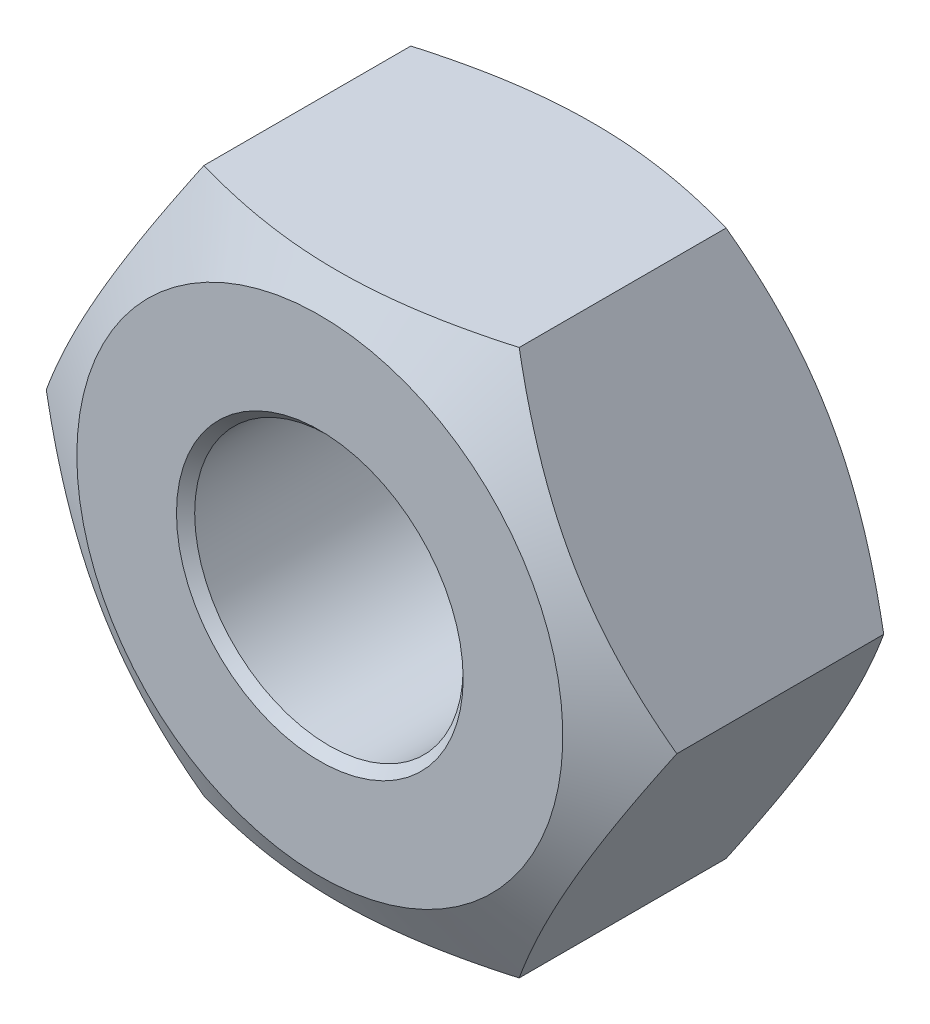
ISO-10303-21;
HEADER;
FILE_DESCRIPTION(('STEP AP214'),'2;1');
FILE_NAME('part.step','',(''),(''),'','','');
FILE_SCHEMA(('AUTOMOTIVE_DESIGN { 1 0 10303 214 1 1 1 1 }'));
ENDSEC;
DATA;
#1=APPLICATION_CONTEXT('core data for automotive mechanical design processes');
#2=APPLICATION_PROTOCOL_DEFINITION('international standard','automotive_design',2000,#1);
#3=PRODUCT_CONTEXT('',#1,'mechanical');
#4=PRODUCT('Part','Part','',(#3));
#5=PRODUCT_RELATED_PRODUCT_CATEGORY('part','',(#4));
#6=PRODUCT_DEFINITION_FORMATION('','',#4);
#7=PRODUCT_DEFINITION_CONTEXT('part definition',#1,'design');
#8=PRODUCT_DEFINITION('design','',#6,#7);
#9=PRODUCT_DEFINITION_SHAPE('','',#8);
#10=(LENGTH_UNIT() NAMED_UNIT(*) SI_UNIT(.MILLI.,.METRE.));
#11=(NAMED_UNIT(*) PLANE_ANGLE_UNIT() SI_UNIT($,.RADIAN.));
#12=(NAMED_UNIT(*) SI_UNIT($,.STERADIAN.) SOLID_ANGLE_UNIT());
#13=UNCERTAINTY_MEASURE_WITH_UNIT(LENGTH_MEASURE(1.E-05),#10,'distance_accuracy_value','');
#14=(GEOMETRIC_REPRESENTATION_CONTEXT(3) GLOBAL_UNCERTAINTY_ASSIGNED_CONTEXT((#13)) GLOBAL_UNIT_ASSIGNED_CONTEXT((#10,
#11,#12)) REPRESENTATION_CONTEXT('',''));
#15=CARTESIAN_POINT('',(0.,0.,0.));
#16=DIRECTION('',(0.,0.,1.));
#17=DIRECTION('',(1.,0.,0.));
#18=AXIS2_PLACEMENT_3D('',#15,#16,#17);
#19=CARTESIAN_POINT('',(-2.88675134594813,-5.,-5.));
#20=DIRECTION('',(0.,-1.,0.));
#21=DIRECTION('',(1.,0.,0.));
#22=AXIS2_PLACEMENT_3D('',#19,#20,#21);
#23=PLANE('',#22);
#24=DIRECTION('',(0.,0.,1.));
#25=VECTOR('',#24,1.);
#26=CARTESIAN_POINT('',(2.88675134594813,-5.,-5.));
#27=LINE('',#26,#25);
#28=CARTESIAN_POINT('',(2.88675134594813,-5.,-4.5534180126148));
#29=VERTEX_POINT('',#28);
#30=CARTESIAN_POINT('',(2.88675134594813,-5.,-0.764124635439491));
#31=VERTEX_POINT('',#30);
#32=EDGE_CURVE('E156',#29,#31,#27,.T.);
#33=ORIENTED_EDGE('',*,*,#32,.T.);
#34=CARTESIAN_POINT('',(-7.61213425479239,-5.,-2.68894648914603));
#35=CARTESIAN_POINT('',(-7.3948889565014,-5.,-2.58414239199444));
#36=CARTESIAN_POINT('',(-7.17712937426538,-5.,-2.48038525661442));
#37=CARTESIAN_POINT('',(-6.74030754384856,-5.,-2.27555685645105));
#38=CARTESIAN_POINT('',(-6.52124508308995,-5.,-2.17448604554796));
#39=CARTESIAN_POINT('',(-6.08034501249064,-5.,-1.97508293678218));
#40=CARTESIAN_POINT('',(-5.85849868010001,-5.,-1.87676985566878));
#41=CARTESIAN_POINT('',(-5.41299082933384,-5.,-1.68436208094923));
#42=CARTESIAN_POINT('',(-5.1893294018471,-5.,-1.59026717764324));
#43=CARTESIAN_POINT('',(-4.73321305137921,-5.,-1.40472032728572));
#44=CARTESIAN_POINT('',(-4.50069300295434,-5.,-1.31342756374782));
#45=CARTESIAN_POINT('',(-4.0328806521826,-5.,-1.13810188533926));
#46=CARTESIAN_POINT('',(-3.79758803488674,-5.,-1.05406980445603));
#47=CARTESIAN_POINT('',(-3.32434461286665,-5.,-0.895576109525233));
#48=CARTESIAN_POINT('',(-3.08640080404566,-5.,-0.82109382456439));
#49=CARTESIAN_POINT('',(-2.60710461151499,-5.,-0.684182629015213));
#50=CARTESIAN_POINT('',(-2.36575337281578,-5.,-0.621749768222116));
#51=CARTESIAN_POINT('',(-1.880803054091,-5.,-0.512345343727814));
#52=CARTESIAN_POINT('',(-1.63722177795954,-5.,-0.465296355150959));
#53=CARTESIAN_POINT('',(-1.1471854987077,-5.,-0.389419092612148));
#54=CARTESIAN_POINT('',(-0.90073072474934,-5.,-0.360589375646157));
#55=CARTESIAN_POINT('',(-0.409334848770287,-5.,-0.323829331526711));
#56=CARTESIAN_POINT('',(-0.164413482834264,-5.,-0.315641623350303));
#57=CARTESIAN_POINT('',(0.325250484148297,-5.,-0.320190384970031));
#58=CARTESIAN_POINT('',(0.569993078418964,-5.,-0.332927610488442));
#59=CARTESIAN_POINT('',(0.989828358735596,-5.,-0.371847045048092));
#60=CARTESIAN_POINT('',(1.16538182546897,-5.,-0.393311120443773));
#61=CARTESIAN_POINT('',(1.51510090460426,-5.,-0.44558937927738));
#62=CARTESIAN_POINT('',(1.6892663058974,-5.,-0.476404958136303));
#63=CARTESIAN_POINT('',(2.20950567321371,-5.,-0.581248029050565));
#64=CARTESIAN_POINT('',(2.5531082161631,-5.,-0.667649433040249));
#65=CARTESIAN_POINT('',(3.06674374801753,-5.,-0.816168336586558));
#66=CARTESIAN_POINT('',(3.23946944011554,-5.,-0.869492780027783));
#67=CARTESIAN_POINT('',(3.58324138994349,-5.,-0.981352614834414));
#68=CARTESIAN_POINT('',(3.75428763687561,-5.,-1.03988803967898));
#69=CARTESIAN_POINT('',(4.09476163313024,-5.,-1.16125800362621));
#70=CARTESIAN_POINT('',(4.26418996591549,-5.,-1.2240909206405));
#71=CARTESIAN_POINT('',(4.60166504972674,-5.,-1.35334949195901));
#72=CARTESIAN_POINT('',(4.76971181361607,-5.,-1.41977511276898));
#73=CARTESIAN_POINT('',(5.15162364790194,-5.,-1.57469885567006));
#74=CARTESIAN_POINT('',(5.3650989772056,-5.,-1.66415571518046));
#75=CARTESIAN_POINT('',(5.79037105085927,-5.,-1.84698394027787));
#76=CARTESIAN_POINT('',(6.00216771571146,-5.,-1.94035548995433));
#77=CARTESIAN_POINT('',(6.4243757668238,-5.,-2.13026222167517));
#78=CARTESIAN_POINT('',(6.63478692347228,-5.,-2.22679791299771));
#79=CARTESIAN_POINT('',(7.05441507049925,-5.,-2.42243424278575));
#80=CARTESIAN_POINT('',(7.26363203938376,-5.,-2.52153492724155));
#81=CARTESIAN_POINT('',(7.89012961940281,-5.,-2.82213872733976));
#82=CARTESIAN_POINT('',(8.30590267455421,-5.,-3.02678226907475));
#83=CARTESIAN_POINT('',(9.13456044626856,-5.,-3.44183489575062));
#84=CARTESIAN_POINT('',(9.54744506984694,-5.,-3.6522441652398));
#85=CARTESIAN_POINT('',(10.1491483676931,-5.,-3.96271346750927));
#86=CARTESIAN_POINT('',(10.3388136141893,-5.,-4.0611374866698));
#87=CARTESIAN_POINT('',(10.717738444617,-5.,-4.2587558659921));
#88=CARTESIAN_POINT('',(10.9069980351519,-5.,-4.3579502134908));
#89=CARTESIAN_POINT('',(11.4742616168287,-5.,-4.656543844784));
#90=CARTESIAN_POINT('',(11.8517372900347,-5.,-4.85694692533336));
#91=CARTESIAN_POINT('',(12.6047822268112,-5.,-5.25937643858843));
#92=CARTESIAN_POINT('',(12.9803538413534,-5.,-5.46139848004441));
#93=CARTESIAN_POINT('',(13.7305954352244,-5.,-5.86706817687967));
#94=CARTESIAN_POINT('',(14.1052654565119,-5.,-6.07071575462754));
#95=CARTESIAN_POINT('',(14.4795992593037,-5.,-6.2749757323787));
#96=B_SPLINE_CURVE_WITH_KNOTS('',3,(#34,#35,#36,#37,#38,#39,#40,#41,#42,#43,#44,#45,#46,#47,#48,
#49,#50,#51,#52,#53,#54,#55,#56,#57,#58,#59,#60,#61,#62,#63,#64,#65,#66,#67,#68,#69,#70,#71,#72,
#73,#74,#75,#76,#77,#78,#79,#80,#81,#82,#83,#84,#85,#86,#87,#88,#89,#90,#91,#92,#93,#94,#95),
.UNSPECIFIED.,.F.,.F.,(4,2,2,2,2,2,2,2,2,2,2,2,2,2,2,2,2,2,2,2,2,2,2,2,2,2,2,2,2,2,4),(0.,
0.723621873606645,1.44736524269466,2.17529398417115,2.90318649763325,3.65249228969477,
4.40188403554204,5.14962527863226,5.8971209691492,6.6407945411558,7.38440920529141,
8.11870497867228,8.85302727236996,9.38334948856281,9.91375087779369,10.9751980231144,
11.5174654180309,12.0597362971217,12.601803613746,13.1438658776264,13.8381979540105,
14.5325627182662,15.2270397967974,15.921529335934,17.3116758698269,18.7018669513559,
19.3429128846726,19.9839483023529,21.2660634794198,22.5454351831284,23.8247461486113),.UNSPECIFIED.);
#97=CARTESIAN_POINT('',(-2.88675134594812,-5.,-0.764124635439491));
#98=VERTEX_POINT('',#97);
#99=EDGE_CURVE('E57',#31,#98,#96,.F.);
#100=ORIENTED_EDGE('',*,*,#99,.T.);
#101=DIRECTION('',(0.,0.,1.));
#102=VECTOR('',#101,1.);
#103=CARTESIAN_POINT('',(-2.88675134594813,-5.,-5.));
#104=LINE('',#103,#102);
#105=CARTESIAN_POINT('',(-2.88675134594813,-5.,-4.5534180126148));
#106=VERTEX_POINT('',#105);
#107=EDGE_CURVE('E131',#106,#98,#104,.T.);
#108=ORIENTED_EDGE('',*,*,#107,.F.);
#109=CARTESIAN_POINT('',(-7.65609177212317,-5.,-2.60736561074588));
#110=CARTESIAN_POINT('',(-7.43656343758357,-5.,-2.71345383603735));
#111=CARTESIAN_POINT('',(-7.21651606414283,-5.,-2.81848745648449));
#112=CARTESIAN_POINT('',(-6.77510259917478,-5.,-3.02584285104626));
#113=CARTESIAN_POINT('',(-6.55373628734637,-5.,-3.12816415563486));
#114=CARTESIAN_POINT('',(-6.10820850200618,-5.,-3.33003131625318));
#115=CARTESIAN_POINT('',(-5.88403828224006,-5.,-3.42955793867599));
#116=CARTESIAN_POINT('',(-5.43385534806404,-5.,-3.62433627144146));
#117=CARTESIAN_POINT('',(-5.20784273042233,-5.,-3.7195882046157));
#118=CARTESIAN_POINT('',(-4.7508098249394,-5.,-3.90581130250879));
#119=CARTESIAN_POINT('',(-4.5197621235661,-5.,-3.99671555609044));
#120=CARTESIAN_POINT('',(-4.05494131662996,-5.,-4.17140441293615));
#121=CARTESIAN_POINT('',(-3.82116791112761,-5.,-4.25518822408778));
#122=CARTESIAN_POINT('',(-3.35100475142416,-5.,-4.4133851804978));
#123=CARTESIAN_POINT('',(-3.11462176833116,-5.,-4.48781824774764));
#124=CARTESIAN_POINT('',(-2.63849286059446,-5.,-4.62489550422514));
#125=CARTESIAN_POINT('',(-2.39874802529956,-5.,-4.68754342151799));
#126=CARTESIAN_POINT('',(-1.91574317494575,-5.,-4.79801221973906));
#127=CARTESIAN_POINT('',(-1.67248224143162,-5.,-4.84582915057248));
#128=CARTESIAN_POINT('',(-1.18299341060266,-5.,-4.92340447175774));
#129=CARTESIAN_POINT('',(-0.936765510666784,-5.,-4.95316284615529));
#130=CARTESIAN_POINT('',(-0.567031819079376,-5.,-4.98234882914511));
#131=CARTESIAN_POINT('',(-0.444104782955955,-5.,-4.98950370802072));
#132=CARTESIAN_POINT('',(-0.198052381774448,-5.,-4.99860456276109));
#133=CARTESIAN_POINT('',(-0.074927019312685,-5.,-5.0005506062699));
#134=CARTESIAN_POINT('',(0.171258785818514,-5.,-4.99918151488384));
#135=CARTESIAN_POINT('',(0.294319237008563,-5.,-4.99586785791504));
#136=CARTESIAN_POINT('',(0.540193677552173,-5.,-4.98406334471061));
#137=CARTESIAN_POINT('',(0.663007654153308,-5.,-4.97557222718951));
#138=CARTESIAN_POINT('',(0.960682957245838,-5.,-4.94889350203738));
#139=CARTESIAN_POINT('',(1.13531547825311,-5.,-4.92811089000247));
#140=CARTESIAN_POINT('',(1.48321793429819,-5.,-4.87723415140654));
#141=CARTESIAN_POINT('',(1.65648768447755,-5.,-4.84713878317962));
#142=CARTESIAN_POINT('',(2.00155552519326,-5.,-4.77870093677783));
#143=CARTESIAN_POINT('',(2.17335196708859,-5.,-4.74035022487923));
#144=CARTESIAN_POINT('',(2.51518303239447,-5.,-4.65657134433363));
#145=CARTESIAN_POINT('',(2.68521776239755,-5.,-4.61114360658132));
#146=CARTESIAN_POINT('',(3.02770462413248,-5.,-4.51311178880933));
#147=CARTESIAN_POINT('',(3.20011394779935,-5.,-4.46035918063097));
#148=CARTESIAN_POINT('',(3.54311022463379,-5.,-4.349641705112));
#149=CARTESIAN_POINT('',(3.71369834521277,-5.,-4.29168043287631));
#150=CARTESIAN_POINT('',(4.05236770745106,-5.,-4.17174287579222));
#151=CARTESIAN_POINT('',(4.22045765494591,-5.,-4.10979102646219));
#152=CARTESIAN_POINT('',(4.55533340532884,-5.,-3.98225110922803));
#153=CARTESIAN_POINT('',(4.72211864960305,-5.,-3.91666157168731));
#154=CARTESIAN_POINT('',(4.88829798170486,-5.,-3.84961303777573));
#155=B_SPLINE_CURVE_WITH_KNOTS('',3,(#109,#110,#111,#112,#113,#114,#115,#116,#117,#118,#119,
#120,#121,#122,#123,#124,#125,#126,#127,#128,#129,#130,#131,#132,#133,#134,#135,#136,#137,#138,
#139,#140,#141,#142,#143,#144,#145,#146,#147,#148,#149,#150,#151,#152,#153,#154),.UNSPECIFIED.,
.F.,.F.,(4,2,2,2,2,2,2,2,2,2,2,2,2,2,2,2,2,2,2,2,2,2,4),(0.,0.731464953869324,1.4630557146924,
2.19883307522443,2.93457203639889,3.67934358933834,4.42419788610861,5.16743732301151,
5.91044124982453,6.6536428992009,7.39684520517621,7.76615669447498,8.13546338772164,
8.50466632765175,8.87388790130249,9.40118856909615,9.92855957198324,10.4564590222235,
10.9843263431151,11.5251238300906,12.0655508754377,12.6029360338292,13.1405399016667),.UNSPECIFIED.);
#156=CARTESIAN_POINT('',(0.,-5.,-5.));
#157=VERTEX_POINT('',#156);
#158=EDGE_CURVE('E258',#106,#157,#155,.T.);
#159=ORIENTED_EDGE('',*,*,#158,.T.);
#160=EDGE_CURVE('E251',#157,#29,#155,.T.);
#161=ORIENTED_EDGE('',*,*,#160,.T.);
#162=EDGE_LOOP('',(#33,#100,#108,#159,#161));
#163=FACE_BOUND('',#162,.T.);
#164=ADVANCED_FACE('F41',(#163),#23,.T.);
#165=CARTESIAN_POINT('',(-5.77350269189626,0.,-5.));
#166=DIRECTION('',(-0.866025403784439,-0.5,0.));
#167=DIRECTION('',(0.5,-0.866025403784439,0.));
#168=AXIS2_PLACEMENT_3D('',#165,#166,#167);
#169=PLANE('',#168);
#170=ORIENTED_EDGE('',*,*,#107,.T.);
#171=CARTESIAN_POINT('',(-2.88663587589429,-5.0002,-0.764191304106116));
#172=CARTESIAN_POINT('',(-3.01349970319368,-4.78046540547481,-0.690929215691922));
#173=CARTESIAN_POINT('',(-3.14144859993849,-4.55885141554042,-0.62429396997238));
#174=CARTESIAN_POINT('',(-3.39956193532121,-4.11178600454649,-0.5079816390651));
#175=CARTESIAN_POINT('',(-3.52973095989718,-3.88632664040923,-0.458345697970078));
#176=CARTESIAN_POINT('',(-3.78847564779797,-3.43816769477649,-0.381093673472988));
#177=CARTESIAN_POINT('',(-3.91701101576052,-3.21553790689581,-0.352963026337779));
#178=CARTESIAN_POINT('',(-4.11026620624322,-2.88081009815336,-0.327737570007975));
#179=CARTESIAN_POINT('',(-4.17472868879311,-2.76915780319494,-0.322156107823774));
#180=CARTESIAN_POINT('',(-4.30371322717528,-2.5457500293262,-0.316744864805761));
#181=CARTESIAN_POINT('',(-4.36823528110588,-2.43399455370969,-0.316914906312494));
#182=CARTESIAN_POINT('',(-4.54500768479194,-2.12781576914936,-0.325296279846327));
#183=CARTESIAN_POINT('',(-4.65719946015292,-1.93349391403279,-0.339372419951542));
#184=CARTESIAN_POINT('',(-4.88083840557981,-1.54613989800229,-0.384007905163721));
#185=CARTESIAN_POINT('',(-4.9922847895602,-1.35310909862843,-0.414582508201798));
#186=CARTESIAN_POINT('',(-5.21637431361295,-0.964974657525145,-0.491011141675453));
#187=CARTESIAN_POINT('',(-5.32898917185759,-0.769920001358263,-0.537189026932969));
#188=CARTESIAN_POINT('',(-5.55253939626498,-0.38271965464123,-0.641994442546222));
#189=CARTESIAN_POINT('',(-5.66347762579592,-0.190569004591912,-0.700597351491662));
#190=CARTESIAN_POINT('',(-5.7736181619501,0.000200000000001565,-0.764191304106116));
#191=B_SPLINE_CURVE_WITH_KNOTS('',3,(#171,#172,#173,#174,#175,#176,#177,#178,#179,#180,#181,
#182,#183,#184,#185,#186,#187,#188,#189,#190),.UNSPECIFIED.,.F.,.F.,(4,2,2,2,2,2,2,2,2,4),(0.,
0.792555841363089,1.58701660053333,2.3618153748728,2.74884076077325,3.13585419177295,
3.80962362599679,4.48401723901189,5.17336882348928,5.86136694793725),.UNSPECIFIED.);
#192=CARTESIAN_POINT('',(-5.77350269189626,0.,-0.764124635439491));
#193=VERTEX_POINT('',#192);
#194=EDGE_CURVE('E114',#98,#193,#191,.T.);
#195=ORIENTED_EDGE('',*,*,#194,.T.);
#196=DIRECTION('',(0.,0.,1.));
#197=VECTOR('',#196,1.);
#198=CARTESIAN_POINT('',(-5.77350269189626,0.,-5.));
#199=LINE('',#198,#197);
#200=CARTESIAN_POINT('',(-5.77350269189626,0.,-4.5534180126148));
#201=VERTEX_POINT('',#200);
#202=EDGE_CURVE('E128',#201,#193,#199,.T.);
#203=ORIENTED_EDGE('',*,*,#202,.F.);
#204=CARTESIAN_POINT('',(-5.7736181619501,0.000200000000001701,-4.55335134394818));
#205=CARTESIAN_POINT('',(-5.64675433465071,-0.219534594525183,-4.62661343236237));
#206=CARTESIAN_POINT('',(-5.5188054379059,-0.441148584459579,-4.69324867808191));
#207=CARTESIAN_POINT('',(-5.26069210252318,-0.888213995453511,-4.80956100898919));
#208=CARTESIAN_POINT('',(-5.13052307794721,-1.11367335959077,-4.85919695008421));
#209=CARTESIAN_POINT('',(-4.87177839004641,-1.56183230522351,-4.9364489745813));
#210=CARTESIAN_POINT('',(-4.74324302208387,-1.78446209310419,-4.96457962171651));
#211=CARTESIAN_POINT('',(-4.54998783160116,-2.11918990184664,-4.98980507804632));
#212=CARTESIAN_POINT('',(-4.48552534905128,-2.23084219680506,-4.99538654023052));
#213=CARTESIAN_POINT('',(-4.35654081066911,-2.45424997067379,-5.00079778324853));
#214=CARTESIAN_POINT('',(-4.2920187567385,-2.56600544629031,-5.0006277417418));
#215=CARTESIAN_POINT('',(-4.11524635305244,-2.87218423085063,-4.99224636820797));
#216=CARTESIAN_POINT('',(-4.00305457769146,-3.06650608596721,-4.97817022810275));
#217=CARTESIAN_POINT('',(-3.77941563226457,-3.4538601019977,-4.93353474289057));
#218=CARTESIAN_POINT('',(-3.66796924828418,-3.64689090137157,-4.90296013985249));
#219=CARTESIAN_POINT('',(-3.44387972423144,-4.03502534247485,-4.82653150637884));
#220=CARTESIAN_POINT('',(-3.3312648659868,-4.23007999864173,-4.78035362112132));
#221=CARTESIAN_POINT('',(-3.1077146415794,-4.61728034535877,-4.67554820550807));
#222=CARTESIAN_POINT('',(-2.99677641204847,-4.80943099540809,-4.61694529656263));
#223=CARTESIAN_POINT('',(-2.88663587589429,-5.0002,-4.55335134394818));
#224=B_SPLINE_CURVE_WITH_KNOTS('',3,(#204,#205,#206,#207,#208,#209,#210,#211,#212,#213,#214,
#215,#216,#217,#218,#219,#220,#221,#222,#223),.UNSPECIFIED.,.F.,.F.,(4,2,2,2,2,2,2,2,2,4),(0.,
0.79255584136309,1.58701660053333,2.3618153748728,2.74884076077325,3.13585419177294,
3.80962362599679,4.48401723901189,5.17336882348928,5.86136694793725),.UNSPECIFIED.);
#225=CARTESIAN_POINT('',(-4.33012701892219,-2.5,-5.));
#226=VERTEX_POINT('',#225);
#227=EDGE_CURVE('E188',#201,#226,#224,.T.);
#228=ORIENTED_EDGE('',*,*,#227,.T.);
#229=EDGE_CURVE('E189',#226,#106,#224,.T.);
#230=ORIENTED_EDGE('',*,*,#229,.T.);
#231=EDGE_LOOP('',(#170,#195,#203,#228,#230));
#232=FACE_BOUND('',#231,.T.);
#233=ADVANCED_FACE('F126',(#232),#169,.T.);
#234=CARTESIAN_POINT('',(-2.88675134594813,5.,-5.));
#235=DIRECTION('',(-0.866025403784439,0.5,0.));
#236=DIRECTION('',(-0.5,-0.866025403784439,0.));
#237=AXIS2_PLACEMENT_3D('',#234,#235,#236);
#238=PLANE('',#237);
#239=ORIENTED_EDGE('',*,*,#202,.T.);
#240=CARTESIAN_POINT('',(-5.77361816195009,-0.000199999999998299,-0.764191304106116));
#241=CARTESIAN_POINT('',(-5.64675433465071,0.219534594525187,-0.690929215691923));
#242=CARTESIAN_POINT('',(-5.5188054379059,0.441148584459582,-0.624293969972381));
#243=CARTESIAN_POINT('',(-5.26069210252318,0.888213995453514,-0.5079816390651));
#244=CARTESIAN_POINT('',(-5.13052307794721,1.11367335959077,-0.458345697970079));
#245=CARTESIAN_POINT('',(-4.87177839004641,1.56183230522351,-0.381093673472988));
#246=CARTESIAN_POINT('',(-4.74324302208387,1.78446209310419,-0.35296302633778));
#247=CARTESIAN_POINT('',(-4.54998783160116,2.11918990184664,-0.327737570007975));
#248=CARTESIAN_POINT('',(-4.48552534905128,2.23084219680506,-0.322156107823775));
#249=CARTESIAN_POINT('',(-4.35654081066911,2.4542499706738,-0.316744864805761));
#250=CARTESIAN_POINT('',(-4.2920187567385,2.56600544629031,-0.316914906312494));
#251=CARTESIAN_POINT('',(-4.11524635305244,2.87218423085064,-0.325296279846328));
#252=CARTESIAN_POINT('',(-4.00305457769146,3.06650608596721,-0.339372419951543));
#253=CARTESIAN_POINT('',(-3.77941563226457,3.45386010199771,-0.384007905163722));
#254=CARTESIAN_POINT('',(-3.66796924828418,3.64689090137157,-0.414582508201799));
#255=CARTESIAN_POINT('',(-3.44387972423144,4.03502534247485,-0.491011141675454));
#256=CARTESIAN_POINT('',(-3.3312648659868,4.23007999864174,-0.53718902693297));
#257=CARTESIAN_POINT('',(-3.10771464157941,4.61728034535877,-0.641994442546223));
#258=CARTESIAN_POINT('',(-2.99677641204847,4.80943099540809,-0.700597351491663));
#259=CARTESIAN_POINT('',(-2.88663587589429,5.0002,-0.764191304106117));
#260=B_SPLINE_CURVE_WITH_KNOTS('',3,(#240,#241,#242,#243,#244,#245,#246,#247,#248,#249,#250,
#251,#252,#253,#254,#255,#256,#257,#258,#259),.UNSPECIFIED.,.F.,.F.,(4,2,2,2,2,2,2,2,2,4),(0.,
0.79255584136309,1.58701660053333,2.3618153748728,2.74884076077325,3.13585419177295,
3.80962362599679,4.48401723901189,5.17336882348928,5.86136694793725),.UNSPECIFIED.);
#261=CARTESIAN_POINT('',(-2.88675134594813,5.,-0.764124635439491));
#262=VERTEX_POINT('',#261);
#263=EDGE_CURVE('E111',#193,#262,#260,.T.);
#264=ORIENTED_EDGE('',*,*,#263,.T.);
#265=DIRECTION('',(0.,0.,1.));
#266=VECTOR('',#265,1.);
#267=CARTESIAN_POINT('',(-2.88675134594813,5.,-5.));
#268=LINE('',#267,#266);
#269=CARTESIAN_POINT('',(-2.88675134594812,5.,-4.5534180126148));
#270=VERTEX_POINT('',#269);
#271=EDGE_CURVE('E139',#270,#262,#268,.T.);
#272=ORIENTED_EDGE('',*,*,#271,.F.);
#273=CARTESIAN_POINT('',(-2.88663587589429,5.0002,-4.55335134394818));
#274=CARTESIAN_POINT('',(-3.01349970319368,4.78046540547482,-4.62661343236237));
#275=CARTESIAN_POINT('',(-3.14144859993849,4.55885141554042,-4.69324867808191));
#276=CARTESIAN_POINT('',(-3.39956193532121,4.11178600454649,-4.80956100898919));
#277=CARTESIAN_POINT('',(-3.52973095989718,3.88632664040923,-4.85919695008421));
#278=CARTESIAN_POINT('',(-3.78847564779797,3.43816769477649,-4.9364489745813));
#279=CARTESIAN_POINT('',(-3.91701101576052,3.21553790689581,-4.96457962171651));
#280=CARTESIAN_POINT('',(-4.11026620624322,2.88081009815336,-4.98980507804632));
#281=CARTESIAN_POINT('',(-4.17472868879311,2.76915780319494,-4.99538654023052));
#282=CARTESIAN_POINT('',(-4.30371322717528,2.54575002932621,-5.00079778324853));
#283=CARTESIAN_POINT('',(-4.36823528110589,2.43399455370969,-5.0006277417418));
#284=CARTESIAN_POINT('',(-4.54500768479194,2.12781576914936,-4.99224636820796));
#285=CARTESIAN_POINT('',(-4.65719946015292,1.93349391403279,-4.97817022810275));
#286=CARTESIAN_POINT('',(-4.88083840557981,1.5461398980023,-4.93353474289057));
#287=CARTESIAN_POINT('',(-4.9922847895602,1.35310909862843,-4.90296013985249));
#288=CARTESIAN_POINT('',(-5.21637431361295,0.964974657525148,-4.82653150637884));
#289=CARTESIAN_POINT('',(-5.32898917185759,0.769920001358266,-4.78035362112132));
#290=CARTESIAN_POINT('',(-5.55253939626498,0.382719654641233,-4.67554820550807));
#291=CARTESIAN_POINT('',(-5.66347762579592,0.190569004591915,-4.61694529656263));
#292=CARTESIAN_POINT('',(-5.7736181619501,-0.000199999999998065,-4.55335134394818));
#293=B_SPLINE_CURVE_WITH_KNOTS('',3,(#273,#274,#275,#276,#277,#278,#279,#280,#281,#282,#283,
#284,#285,#286,#287,#288,#289,#290,#291,#292),.UNSPECIFIED.,.F.,.F.,(4,2,2,2,2,2,2,2,2,4),(0.,
0.792555841363089,1.58701660053333,2.3618153748728,2.74884076077325,3.13585419177295,
3.80962362599679,4.48401723901189,5.17336882348928,5.86136694793725),.UNSPECIFIED.);
#294=CARTESIAN_POINT('',(-4.33012701892219,2.5,-5.));
#295=VERTEX_POINT('',#294);
#296=EDGE_CURVE('E160',#270,#295,#293,.T.);
#297=ORIENTED_EDGE('',*,*,#296,.T.);
#298=EDGE_CURVE('E137',#295,#201,#293,.T.);
#299=ORIENTED_EDGE('',*,*,#298,.T.);
#300=EDGE_LOOP('',(#239,#264,#272,#297,#299));
#301=FACE_BOUND('',#300,.T.);
#302=ADVANCED_FACE('F135',(#301),#238,.T.);
#303=CARTESIAN_POINT('',(2.88675134594813,5.,-5.));
#304=DIRECTION('',(0.,1.,0.));
#305=DIRECTION('',(0.,0.,1.));
#306=AXIS2_PLACEMENT_3D('',#303,#304,#305);
#307=PLANE('',#306);
#308=ORIENTED_EDGE('',*,*,#271,.T.);
#309=CARTESIAN_POINT('',(-7.612134254772,5.,-2.68894648913619));
#310=CARTESIAN_POINT('',(-7.39488895648169,5.,-2.58414239198502));
#311=CARTESIAN_POINT('',(-7.17712937424636,5.,-2.48038525660541));
#312=CARTESIAN_POINT('',(-6.74030754383091,5.,-2.27555685644286));
#313=CARTESIAN_POINT('',(-6.52124508307299,5.,-2.17448604554019));
#314=CARTESIAN_POINT('',(-6.08034501247506,5.,-1.97508293677523));
#315=CARTESIAN_POINT('',(-5.85849868008513,5.,-1.87676985566225));
#316=CARTESIAN_POINT('',(-5.41299082932036,5.,-1.68436208094352));
#317=CARTESIAN_POINT('',(-5.18932940183432,5.,-1.59026717763793));
#318=CARTESIAN_POINT('',(-4.73321305136788,5.,-1.40472032728123));
#319=CARTESIAN_POINT('',(-4.50069300294377,5.,-1.31342756374374));
#320=CARTESIAN_POINT('',(-4.03288065217354,5.,-1.13810188533598));
#321=CARTESIAN_POINT('',(-3.79758803487843,5.,-1.05406980445314));
#322=CARTESIAN_POINT('',(-3.32434461285989,5.,-0.895576109523079));
#323=CARTESIAN_POINT('',(-3.08640080403967,5.,-0.821093824562585));
#324=CARTESIAN_POINT('',(-2.60710461151058,5.,-0.684182629014047));
#325=CARTESIAN_POINT('',(-2.36575337281217,5.,-0.621749768221239));
#326=CARTESIAN_POINT('',(-1.88080305408941,5.,-0.512345343727518));
#327=CARTESIAN_POINT('',(-1.63722177795919,5.,-0.465296355150928));
#328=CARTESIAN_POINT('',(-1.14718549870984,5.,-0.389419092612458));
#329=CARTESIAN_POINT('',(-0.900730724752741,5.,-0.360589375646543));
#330=CARTESIAN_POINT('',(-0.409334848776189,5.,-0.323829331527026));
#331=CARTESIAN_POINT('',(-0.164413482841405,5.,-0.315641623350474));
#332=CARTESIAN_POINT('',(0.3252504841387,5.,-0.320190384969707));
#333=CARTESIAN_POINT('',(0.569993078408149,5.,-0.332927610487765));
#334=CARTESIAN_POINT('',(0.989828358723215,5.,-0.371847045046711));
#335=CARTESIAN_POINT('',(1.16538182545623,5.,-0.393311120442108));
#336=CARTESIAN_POINT('',(1.51510090459081,5.,-0.445589379275133));
#337=CARTESIAN_POINT('',(1.68926630588361,5.,-0.476404958133757));
#338=CARTESIAN_POINT('',(2.20950567319889,5.,-0.581248029047114));
#339=CARTESIAN_POINT('',(2.55310821614763,5.,-0.667649433036187));
#340=CARTESIAN_POINT('',(3.06674374800107,5.,-0.81616833658159));
#341=CARTESIAN_POINT('',(3.23946944009875,5.,-0.869492780022511));
#342=CARTESIAN_POINT('',(3.58324138992603,5.,-0.981352614828542));
#343=CARTESIAN_POINT('',(3.75428763685782,5.,-1.03988803967281));
#344=CARTESIAN_POINT('',(4.09476163311179,5.,-1.16125800361946));
#345=CARTESIAN_POINT('',(4.26418996589671,5.,-1.22409092063346));
#346=CARTESIAN_POINT('',(4.6016650497073,5.,-1.35334949195141));
#347=CARTESIAN_POINT('',(4.76971181359631,5.,-1.4197751127611));
#348=CARTESIAN_POINT('',(5.15162364788193,5.,-1.57469885566176));
#349=CARTESIAN_POINT('',(5.36509897718568,5.,-1.66415571517204));
#350=CARTESIAN_POINT('',(5.7903710508395,5.,-1.84698394026923));
#351=CARTESIAN_POINT('',(6.00216771569177,5.,-1.94035548994559));
#352=CARTESIAN_POINT('',(6.42437576680425,5.,-2.13026222166626));
#353=CARTESIAN_POINT('',(6.6347869234528,5.,-2.22679791298873));
#354=CARTESIAN_POINT('',(7.05441507047989,5.,-2.42243424277663));
#355=CARTESIAN_POINT('',(7.26363203936446,5.,-2.52153492723237));
#356=CARTESIAN_POINT('',(7.89012961938369,5.,-2.82213872733043));
#357=CARTESIAN_POINT('',(8.3059026745352,5.,-3.02678226906534));
#358=CARTESIAN_POINT('',(9.13456044624975,5.,-3.44183489574108));
#359=CARTESIAN_POINT('',(9.54744506982822,5.,-3.65224416523023));
#360=CARTESIAN_POINT('',(10.1491483676744,5.,-3.96271346749962));
#361=CARTESIAN_POINT('',(10.3388136141706,5.,-4.06113748666013));
#362=CARTESIAN_POINT('',(10.7177384445984,5.,-4.25875586598237));
#363=CARTESIAN_POINT('',(10.9069980351333,5.,-4.35795021348105));
#364=CARTESIAN_POINT('',(11.4742616168101,5.,-4.65654384477416));
#365=CARTESIAN_POINT('',(11.8517372900161,5.,-4.85694692532347));
#366=CARTESIAN_POINT('',(12.6047822267926,5.,-5.25937643857846));
#367=CARTESIAN_POINT('',(12.9803538413348,5.,-5.46139848003439));
#368=CARTESIAN_POINT('',(13.7305954352058,5.,-5.86706817686958));
#369=CARTESIAN_POINT('',(14.1052654564933,5.,-6.07071575461741));
#370=CARTESIAN_POINT('',(14.4795992592851,5.,-6.27497573236854));
#371=B_SPLINE_CURVE_WITH_KNOTS('',3,(#309,#310,#311,#312,#313,#314,#315,#316,#317,#318,#319,
#320,#321,#322,#323,#324,#325,#326,#327,#328,#329,#330,#331,#332,#333,#334,#335,#336,#337,#338,
#339,#340,#341,#342,#343,#344,#345,#346,#347,#348,#349,#350,#351,#352,#353,#354,#355,#356,#357,
#358,#359,#360,#361,#362,#363,#364,#365,#366,#367,#368,#369,#370),.UNSPECIFIED.,.F.,.F.,(4,2,2,
2,2,2,2,2,2,2,2,2,2,2,2,2,2,2,2,2,2,2,2,2,2,2,2,2,2,2,4),(0.,0.72362187360426,1.44736524268989,
2.17529398416396,2.90318649762364,3.65249228968262,4.40188403552734,5.14962527861503,
5.89712096912944,6.64079454113226,7.38440920526411,8.11870497864128,8.85302727233528,
9.38334948852695,9.91375087775665,10.975198023075,11.5174654179903,12.0597362970799,
12.601803613703,13.1438658775821,13.8381979539662,14.5325627182221,15.2270397967533,
15.9215293358901,17.3116758697831,18.7018669513123,19.342912884629,19.9839483023093,
21.2660634793761,22.5454351830846,23.8247461485675),.UNSPECIFIED.);
#372=CARTESIAN_POINT('',(2.88675134594813,5.,-0.764124635439491));
#373=VERTEX_POINT('',#372);
#374=EDGE_CURVE('E116',#262,#373,#371,.T.);
#375=ORIENTED_EDGE('',*,*,#374,.T.);
#376=DIRECTION('',(0.,0.,1.));
#377=VECTOR('',#376,1.);
#378=CARTESIAN_POINT('',(2.88675134594813,5.,-5.));
#379=LINE('',#378,#377);
#380=CARTESIAN_POINT('',(2.88675134594813,5.,-4.5534180126148));
#381=VERTEX_POINT('',#380);
#382=EDGE_CURVE('E145',#381,#373,#379,.T.);
#383=ORIENTED_EDGE('',*,*,#382,.F.);
#384=CARTESIAN_POINT('',(-7.65608998744864,5.,-2.60736647344924));
#385=CARTESIAN_POINT('',(-7.43656171400166,5.,-2.71345466182797));
#386=CARTESIAN_POINT('',(-7.21651440170021,5.,-2.81848824538408));
#387=CARTESIAN_POINT('',(-6.77510105921518,5.,-3.02584356636028));
#388=CARTESIAN_POINT('',(-6.55373480873052,5.,-3.12816483425435));
#389=CARTESIAN_POINT('',(-6.10820714710356,5.,-3.33003192146512));
#390=CARTESIAN_POINT('',(-5.88403698971123,5.,-3.42955850718273));
#391=CARTESIAN_POINT('',(-5.43385418074676,5.,-3.62433676721321));
#392=CARTESIAN_POINT('',(-5.20784162594277,5.,-3.7195886643576));
#393=CARTESIAN_POINT('',(-4.75080884782755,5.,-3.90581169081061));
#394=CARTESIAN_POINT('',(-4.51976121099504,5.,-3.99671590900132));
#395=CARTESIAN_POINT('',(-4.05494053422099,5.,-4.17140469702807));
#396=CARTESIAN_POINT('',(-3.82116719434024,5.,-4.25518847475236));
#397=CARTESIAN_POINT('',(-3.35100416711888,5.,-4.41338536763539));
#398=CARTESIAN_POINT('',(-3.11462125088187,5.,-4.48781840477474));
#399=CARTESIAN_POINT('',(-2.63849247870023,5.,-4.62489560612763));
#400=CARTESIAN_POINT('',(-2.3987477121033,5.,-4.68754349840306));
#401=CARTESIAN_POINT('',(-1.91574303714497,5.,-4.79801224600514));
#402=CARTESIAN_POINT('',(-1.67248221084099,5.,-4.84582915344136));
#403=CARTESIAN_POINT('',(-1.18299359688664,5.,-4.9234044442076));
#404=CARTESIAN_POINT('',(-0.936765806613279,5.,-4.95316281157159));
#405=CARTESIAN_POINT('',(-0.567032279323847,5.,-4.9823487984137));
#406=CARTESIAN_POINT('',(-0.444105297658539,5.,-4.98950368094005));
#407=CARTESIAN_POINT('',(-0.198053005238565,5.,-4.99860454773096));
#408=CARTESIAN_POINT('',(-0.0749276970802295,5.,-5.00055059963961));
#409=CARTESIAN_POINT('',(0.171257999892351,5.,-4.99918152965434));
#410=CARTESIAN_POINT('',(0.294318397227086,5.,-4.99586788568699));
#411=CARTESIAN_POINT('',(0.540192730788838,5.,-4.98406340271724));
#412=CARTESIAN_POINT('',(0.663006654263481,5.,-4.97557230242984));
#413=CARTESIAN_POINT('',(0.960681872881669,5.,-4.9488936197247));
#414=CARTESIAN_POINT('',(1.1353143627994,5.,-4.92811103230171));
#415=CARTESIAN_POINT('',(1.4832167579939,5.,-4.8772343442773));
#416=CARTESIAN_POINT('',(1.65648647841238,5.,-4.84713900200997));
#417=CARTESIAN_POINT('',(2.00155426058702,5.,-4.77870120798845));
#418=CARTESIAN_POINT('',(2.17335067370376,5.,-4.74035052251359));
#419=CARTESIAN_POINT('',(2.51518168221058,5.,-4.65657169461499));
#420=CARTESIAN_POINT('',(2.68521638419314,5.,-4.61114398308599));
#421=CARTESIAN_POINT('',(3.02770318928897,5.,-4.5131122179457));
#422=CARTESIAN_POINT('',(3.20011248435317,5.,-4.46035963617605));
#423=CARTESIAN_POINT('',(3.54310870430182,5.,-4.34964221269737));
#424=CARTESIAN_POINT('',(3.7136967965972,5.,-4.29168096609292));
#425=CARTESIAN_POINT('',(4.0523661026798,5.,-4.17174345927152));
#426=CARTESIAN_POINT('',(4.22045602230063,5.,-4.10979163457362));
#427=CARTESIAN_POINT('',(4.55533171687456,5.,-3.98225176586187));
#428=CARTESIAN_POINT('',(4.72211693321423,5.,-3.91666225221222));
#429=CARTESIAN_POINT('',(4.88829623733364,5.,-3.84961374182274));
#430=B_SPLINE_CURVE_WITH_KNOTS('',3,(#384,#385,#386,#387,#388,#389,#390,#391,#392,#393,#394,
#395,#396,#397,#398,#399,#400,#401,#402,#403,#404,#405,#406,#407,#408,#409,#410,#411,#412,#413,
#414,#415,#416,#417,#418,#419,#420,#421,#422,#423,#424,#425,#426,#427,#428,#429),.UNSPECIFIED.,
.F.,.F.,(4,2,2,2,2,2,2,2,2,2,2,2,2,2,2,2,2,2,2,2,2,2,4),(0.,0.731464740665349,1.46305528824908,
2.19883243307486,2.93457117856033,3.67934251246857,4.4241965901336,5.16743580871988,
5.91043951739337,6.65364083834805,7.39684281638514,7.76615414335454,8.13546067426608,
8.50466345177854,8.8738848629845,9.40118542949726,9.92855633110015,10.4564556797854,
10.9843228991235,11.525120280828,12.0655472210641,12.6029322754131,13.1405360390026),.UNSPECIFIED.);
#431=CARTESIAN_POINT('',(0.,5.,-5.));
#432=VERTEX_POINT('',#431);
#433=EDGE_CURVE('E198',#381,#432,#430,.F.);
#434=ORIENTED_EDGE('',*,*,#433,.T.);
#435=EDGE_CURVE('E192',#432,#270,#430,.F.);
#436=ORIENTED_EDGE('',*,*,#435,.T.);
#437=EDGE_LOOP('',(#308,#375,#383,#434,#436));
#438=FACE_BOUND('',#437,.T.);
#439=ADVANCED_FACE('F310',(#438),#307,.T.);
#440=CARTESIAN_POINT('',(5.77350269189626,0.,-5.));
#441=DIRECTION('',(0.866025403784438,0.500000000000001,0.));
#442=DIRECTION('',(-0.500000000000001,0.866025403784438,0.));
#443=AXIS2_PLACEMENT_3D('',#440,#441,#442);
#444=PLANE('',#443);
#445=ORIENTED_EDGE('',*,*,#382,.T.);
#446=CARTESIAN_POINT('',(2.88663587589429,5.0002,-0.764191304106116));
#447=CARTESIAN_POINT('',(3.01349970319368,4.78046540547482,-0.690929215691923));
#448=CARTESIAN_POINT('',(3.14144859993849,4.55885141554042,-0.624293969972381));
#449=CARTESIAN_POINT('',(3.39956193532121,4.11178600454649,-0.507981639065101));
#450=CARTESIAN_POINT('',(3.52973095989718,3.88632664040923,-0.458345697970079));
#451=CARTESIAN_POINT('',(3.78847564779797,3.43816769477649,-0.381093673472989));
#452=CARTESIAN_POINT('',(3.91701101576052,3.21553790689581,-0.35296302633778));
#453=CARTESIAN_POINT('',(4.11026620624322,2.88081009815336,-0.327737570007975));
#454=CARTESIAN_POINT('',(4.17472868879311,2.76915780319494,-0.322156107823775));
#455=CARTESIAN_POINT('',(4.30371322717528,2.5457500293262,-0.316744864805761));
#456=CARTESIAN_POINT('',(4.36823528110589,2.43399455370969,-0.316914906312495));
#457=CARTESIAN_POINT('',(4.54500768479194,2.12781576914936,-0.325296279846328));
#458=CARTESIAN_POINT('',(4.65719946015292,1.93349391403279,-0.339372419951543));
#459=CARTESIAN_POINT('',(4.88083840557981,1.5461398980023,-0.384007905163722));
#460=CARTESIAN_POINT('',(4.9922847895602,1.35310909862843,-0.414582508201799));
#461=CARTESIAN_POINT('',(5.21637431361295,0.964974657525149,-0.491011141675454));
#462=CARTESIAN_POINT('',(5.32898917185759,0.769920001358268,-0.53718902693297));
#463=CARTESIAN_POINT('',(5.55253939626498,0.382719654641235,-0.641994442546223));
#464=CARTESIAN_POINT('',(5.66347762579592,0.190569004591917,-0.700597351491663));
#465=CARTESIAN_POINT('',(5.7736181619501,-0.000199999999996449,-0.764191304106117));
#466=B_SPLINE_CURVE_WITH_KNOTS('',3,(#446,#447,#448,#449,#450,#451,#452,#453,#454,#455,#456,
#457,#458,#459,#460,#461,#462,#463,#464,#465),.UNSPECIFIED.,.F.,.F.,(4,2,2,2,2,2,2,2,2,4),(0.,
0.79255584136309,1.58701660053333,2.3618153748728,2.74884076077325,3.13585419177295,
3.80962362599679,4.48401723901189,5.17336882348928,5.86136694793725),.UNSPECIFIED.);
#467=CARTESIAN_POINT('',(5.77350269189626,0.,-0.764124635439491));
#468=VERTEX_POINT('',#467);
#469=EDGE_CURVE('E293',#373,#468,#466,.T.);
#470=ORIENTED_EDGE('',*,*,#469,.T.);
#471=DIRECTION('',(0.,0.,1.));
#472=VECTOR('',#471,1.);
#473=CARTESIAN_POINT('',(5.77350269189626,0.,-5.));
#474=LINE('',#473,#472);
#475=CARTESIAN_POINT('',(5.77350269189626,0.,-4.5534180126148));
#476=VERTEX_POINT('',#475);
#477=EDGE_CURVE('E152',#476,#468,#474,.T.);
#478=ORIENTED_EDGE('',*,*,#477,.F.);
#479=CARTESIAN_POINT('',(5.7736181619501,-0.000199999999996842,-4.55335134394818));
#480=CARTESIAN_POINT('',(5.64675433465071,0.219534594525188,-4.62661343236237));
#481=CARTESIAN_POINT('',(5.5188054379059,0.441148584459584,-4.69324867808191));
#482=CARTESIAN_POINT('',(5.26069210252318,0.888213995453516,-4.80956100898919));
#483=CARTESIAN_POINT('',(5.13052307794721,1.11367335959078,-4.85919695008421));
#484=CARTESIAN_POINT('',(4.87177839004641,1.56183230522351,-4.9364489745813));
#485=CARTESIAN_POINT('',(4.74324302208387,1.78446209310419,-4.96457962171651));
#486=CARTESIAN_POINT('',(4.54998783160116,2.11918990184664,-4.98980507804632));
#487=CARTESIAN_POINT('',(4.48552534905128,2.23084219680506,-4.99538654023052));
#488=CARTESIAN_POINT('',(4.35654081066911,2.4542499706738,-5.00079778324853));
#489=CARTESIAN_POINT('',(4.2920187567385,2.56600544629031,-5.0006277417418));
#490=CARTESIAN_POINT('',(4.11524635305244,2.87218423085064,-4.99224636820796));
#491=CARTESIAN_POINT('',(4.00305457769146,3.06650608596721,-4.97817022810275));
#492=CARTESIAN_POINT('',(3.77941563226457,3.4538601019977,-4.93353474289057));
#493=CARTESIAN_POINT('',(3.66796924828418,3.64689090137157,-4.90296013985249));
#494=CARTESIAN_POINT('',(3.44387972423144,4.03502534247485,-4.82653150637884));
#495=CARTESIAN_POINT('',(3.3312648659868,4.23007999864173,-4.78035362112132));
#496=CARTESIAN_POINT('',(3.1077146415794,4.61728034535877,-4.67554820550807));
#497=CARTESIAN_POINT('',(2.99677641204847,4.80943099540809,-4.61694529656263));
#498=CARTESIAN_POINT('',(2.88663587589429,5.0002,-4.55335134394818));
#499=B_SPLINE_CURVE_WITH_KNOTS('',3,(#479,#480,#481,#482,#483,#484,#485,#486,#487,#488,#489,
#490,#491,#492,#493,#494,#495,#496,#497,#498),.UNSPECIFIED.,.F.,.F.,(4,2,2,2,2,2,2,2,2,4),(0.,
0.79255584136309,1.58701660053333,2.3618153748728,2.74884076077325,3.13585419177295,
3.80962362599679,4.48401723901189,5.17336882348928,5.86136694793725),.UNSPECIFIED.);
#500=CARTESIAN_POINT('',(4.33012701892219,2.5,-5.));
#501=VERTEX_POINT('',#500);
#502=EDGE_CURVE('E244',#476,#501,#499,.T.);
#503=ORIENTED_EDGE('',*,*,#502,.T.);
#504=EDGE_CURVE('E331',#501,#381,#499,.T.);
#505=ORIENTED_EDGE('',*,*,#504,.T.);
#506=EDGE_LOOP('',(#445,#470,#478,#503,#505));
#507=FACE_BOUND('',#506,.T.);
#508=ADVANCED_FACE('F314',(#507),#444,.T.);
#509=CARTESIAN_POINT('',(2.88675134594813,-5.,-5.));
#510=DIRECTION('',(0.866025403784439,-0.5,0.));
#511=DIRECTION('',(0.5,0.866025403784439,0.));
#512=AXIS2_PLACEMENT_3D('',#509,#510,#511);
#513=PLANE('',#512);
#514=ORIENTED_EDGE('',*,*,#477,.T.);
#515=CARTESIAN_POINT('',(5.7736181619501,0.000200000000003158,-0.764191304106117));
#516=CARTESIAN_POINT('',(5.64675433465071,-0.219534594525183,-0.690929215691924));
#517=CARTESIAN_POINT('',(5.5188054379059,-0.441148584459578,-0.624293969972381));
#518=CARTESIAN_POINT('',(5.26069210252318,-0.88821399545351,-0.507981639065101));
#519=CARTESIAN_POINT('',(5.13052307794721,-1.11367335959077,-0.458345697970079));
#520=CARTESIAN_POINT('',(4.87177839004641,-1.56183230522351,-0.381093673472989));
#521=CARTESIAN_POINT('',(4.74324302208387,-1.78446209310419,-0.35296302633778));
#522=CARTESIAN_POINT('',(4.54998783160116,-2.11918990184664,-0.327737570007976));
#523=CARTESIAN_POINT('',(4.48552534905128,-2.23084219680506,-0.322156107823775));
#524=CARTESIAN_POINT('',(4.35654081066911,-2.45424997067379,-0.316744864805761));
#525=CARTESIAN_POINT('',(4.2920187567385,-2.56600544629031,-0.316914906312494));
#526=CARTESIAN_POINT('',(4.11524635305244,-2.87218423085063,-0.325296279846327));
#527=CARTESIAN_POINT('',(4.00305457769146,-3.06650608596721,-0.339372419951542));
#528=CARTESIAN_POINT('',(3.77941563226457,-3.4538601019977,-0.384007905163721));
#529=CARTESIAN_POINT('',(3.66796924828419,-3.64689090137157,-0.414582508201798));
#530=CARTESIAN_POINT('',(3.44387972423144,-4.03502534247485,-0.491011141675453));
#531=CARTESIAN_POINT('',(3.3312648659868,-4.23007999864173,-0.537189026932969));
#532=CARTESIAN_POINT('',(3.1077146415794,-4.61728034535877,-0.641994442546222));
#533=CARTESIAN_POINT('',(2.99677641204847,-4.80943099540808,-0.700597351491661));
#534=CARTESIAN_POINT('',(2.88663587589429,-5.0002,-0.764191304106115));
#535=B_SPLINE_CURVE_WITH_KNOTS('',3,(#515,#516,#517,#518,#519,#520,#521,#522,#523,#524,#525,
#526,#527,#528,#529,#530,#531,#532,#533,#534),.UNSPECIFIED.,.F.,.F.,(4,2,2,2,2,2,2,2,2,4),(0.,
0.79255584136309,1.58701660053333,2.3618153748728,2.74884076077325,3.13585419177295,
3.80962362599679,4.48401723901189,5.17336882348929,5.86136694793725),.UNSPECIFIED.);
#536=EDGE_CURVE('E284',#468,#31,#535,.T.);
#537=ORIENTED_EDGE('',*,*,#536,.T.);
#538=ORIENTED_EDGE('',*,*,#32,.F.);
#539=CARTESIAN_POINT('',(2.88663587589429,-5.0002,-4.55335134394818));
#540=CARTESIAN_POINT('',(3.01349970319368,-4.78046540547481,-4.62661343236237));
#541=CARTESIAN_POINT('',(3.14144859993849,-4.55885141554042,-4.69324867808191));
#542=CARTESIAN_POINT('',(3.39956193532121,-4.11178600454649,-4.80956100898919));
#543=CARTESIAN_POINT('',(3.52973095989718,-3.88632664040923,-4.85919695008421));
#544=CARTESIAN_POINT('',(3.78847564779797,-3.43816769477649,-4.9364489745813));
#545=CARTESIAN_POINT('',(3.91701101576052,-3.21553790689581,-4.96457962171651));
#546=CARTESIAN_POINT('',(4.11026620624322,-2.88081009815336,-4.98980507804632));
#547=CARTESIAN_POINT('',(4.17472868879311,-2.76915780319494,-4.99538654023052));
#548=CARTESIAN_POINT('',(4.30371322717528,-2.5457500293262,-5.00079778324853));
#549=CARTESIAN_POINT('',(4.36823528110589,-2.43399455370969,-5.0006277417418));
#550=CARTESIAN_POINT('',(4.54500768479194,-2.12781576914936,-4.99224636820796));
#551=CARTESIAN_POINT('',(4.65719946015292,-1.93349391403279,-4.97817022810275));
#552=CARTESIAN_POINT('',(4.88083840557981,-1.54613989800229,-4.93353474289057));
#553=CARTESIAN_POINT('',(4.9922847895602,-1.35310909862843,-4.90296013985249));
#554=CARTESIAN_POINT('',(5.21637431361295,-0.964974657525144,-4.82653150637884));
#555=CARTESIAN_POINT('',(5.32898917185759,-0.769920001358263,-4.78035362112132));
#556=CARTESIAN_POINT('',(5.55253939626498,-0.38271965464123,-4.67554820550807));
#557=CARTESIAN_POINT('',(5.66347762579592,-0.190569004591911,-4.61694529656263));
#558=CARTESIAN_POINT('',(5.7736181619501,0.000200000000002958,-4.55335134394818));
#559=B_SPLINE_CURVE_WITH_KNOTS('',3,(#539,#540,#541,#542,#543,#544,#545,#546,#547,#548,#549,
#550,#551,#552,#553,#554,#555,#556,#557,#558),.UNSPECIFIED.,.F.,.F.,(4,2,2,2,2,2,2,2,2,4),(0.,
0.79255584136309,1.58701660053333,2.3618153748728,2.74884076077325,3.13585419177294,
3.80962362599679,4.48401723901189,5.17336882348928,5.86136694793725),.UNSPECIFIED.);
#560=CARTESIAN_POINT('',(4.33012701892219,-2.5,-5.));
#561=VERTEX_POINT('',#560);
#562=EDGE_CURVE('E484',#29,#561,#559,.T.);
#563=ORIENTED_EDGE('',*,*,#562,.T.);
#564=EDGE_CURVE('E234',#561,#476,#559,.T.);
#565=ORIENTED_EDGE('',*,*,#564,.T.);
#566=EDGE_LOOP('',(#514,#537,#538,#563,#565));
#567=FACE_BOUND('',#566,.T.);
#568=ADVANCED_FACE('F262',(#567),#513,.T.);
#569=CARTESIAN_POINT('',(-2.88675134594813,-5.,0.));
#570=DIRECTION('',(0.,0.,-1.));
#571=DIRECTION('',(-1.,0.,0.));
#572=AXIS2_PLACEMENT_3D('',#569,#570,#571);
#573=PLANE('',#572);
#574=CARTESIAN_POINT('',(0.,0.,0.));
#575=DIRECTION('',(0.,0.,-1.));
#576=DIRECTION('',(-1.,0.,0.));
#577=AXIS2_PLACEMENT_3D('',#574,#575,#576);
#578=CIRCLE('',#577,2.62516666666666);
#579=CARTESIAN_POINT('',(-2.62516666666666,0.,0.));
#580=VERTEX_POINT('',#579);
#581=EDGE_CURVE('E11',#580,#580,#578,.T.);
#582=ORIENTED_EDGE('',*,*,#581,.T.);
#583=EDGE_LOOP('',(#582));
#584=FACE_BOUND('',#583,.T.);
#585=CARTESIAN_POINT('',(0.,0.,0.));
#586=DIRECTION('',(0.,0.,-1.));
#587=DIRECTION('',(-1.,0.,0.));
#588=AXIS2_PLACEMENT_3D('',#585,#586,#587);
#589=CIRCLE('',#588,4.45);
#590=CARTESIAN_POINT('',(-4.45,0.,0.));
#591=VERTEX_POINT('',#590);
#592=EDGE_CURVE('E335',#591,#591,#589,.T.);
#593=ORIENTED_EDGE('',*,*,#592,.F.);
#594=EDGE_LOOP('',(#593));
#595=FACE_BOUND('',#594,.T.);
#596=ADVANCED_FACE('F324',(#584,#595),#573,.F.);
#597=CARTESIAN_POINT('',(-2.88675134594813,-5.,-5.));
#598=DIRECTION('',(0.,0.,-1.));
#599=DIRECTION('',(-1.,0.,0.));
#600=AXIS2_PLACEMENT_3D('',#597,#598,#599);
#601=PLANE('',#600);
#602=CARTESIAN_POINT('',(0.,0.,-5.));
#603=DIRECTION('',(0.,0.,1.));
#604=DIRECTION('',(1.,0.,0.));
#605=AXIS2_PLACEMENT_3D('',#602,#603,#604);
#606=CIRCLE('',#605,3.375);
#607=CARTESIAN_POINT('',(3.375,0.,-5.));
#608=VERTEX_POINT('',#607);
#609=EDGE_CURVE('E475',#608,#608,#606,.T.);
#610=ORIENTED_EDGE('',*,*,#609,.T.);
#611=EDGE_LOOP('',(#610));
#612=FACE_BOUND('',#611,.T.);
#613=CARTESIAN_POINT('',(0.,0.,-5.));
#614=DIRECTION('',(0.,0.,-1.));
#615=DIRECTION('',(-1.,0.,0.));
#616=AXIS2_PLACEMENT_3D('',#613,#614,#615);
#617=CIRCLE('',#616,5.);
#618=EDGE_CURVE('E143',#226,#295,#617,.T.);
#619=ORIENTED_EDGE('',*,*,#618,.T.);
#620=EDGE_CURVE('E65',#295,#432,#617,.T.);
#621=ORIENTED_EDGE('',*,*,#620,.T.);
#622=CARTESIAN_POINT('',(0.,0.,-5.));
#623=DIRECTION('',(0.,0.,1.));
#624=DIRECTION('',(1.,0.,0.));
#625=AXIS2_PLACEMENT_3D('',#622,#623,#624);
#626=CIRCLE('',#625,5.);
#627=EDGE_CURVE('E478',#501,#432,#626,.T.);
#628=ORIENTED_EDGE('',*,*,#627,.F.);
#629=EDGE_CURVE('E169',#501,#561,#617,.T.);
#630=ORIENTED_EDGE('',*,*,#629,.T.);
#631=EDGE_CURVE('E175',#561,#157,#617,.T.);
#632=ORIENTED_EDGE('',*,*,#631,.T.);
#633=EDGE_CURVE('E163',#157,#226,#617,.T.);
#634=ORIENTED_EDGE('',*,*,#633,.T.);
#635=EDGE_LOOP('',(#619,#621,#628,#630,#632,#634));
#636=FACE_BOUND('',#635,.T.);
#637=ADVANCED_FACE('F185',(#612,#636),#601,.T.);
#638=CARTESIAN_POINT('',(0.,0.,-5.));
#639=DIRECTION('',(0.,0.,1.));
#640=DIRECTION('',(1.,0.,0.));
#641=AXIS2_PLACEMENT_3D('',#638,#639,#640);
#642=CYLINDRICAL_SURFACE('',#641,2.4585);
#643=CARTESIAN_POINT('',(0.,0.,-0.166666666666667));
#644=DIRECTION('',(0.,0.,-1.));
#645=DIRECTION('',(-1.,0.,0.));
#646=AXIS2_PLACEMENT_3D('',#643,#644,#645);
#647=CIRCLE('',#646,2.4585);
#648=CARTESIAN_POINT('',(-2.4585,0.,-0.166666666666667));
#649=VERTEX_POINT('',#648);
#650=EDGE_CURVE('E50',#649,#649,#647,.F.);
#651=ORIENTED_EDGE('',*,*,#650,.T.);
#652=EDGE_LOOP('',(#651));
#653=FACE_BOUND('',#652,.T.);
#654=CARTESIAN_POINT('',(0.,0.,-4.4708584782877));
#655=DIRECTION('',(0.,0.,1.));
#656=DIRECTION('',(1.,0.,0.));
#657=AXIS2_PLACEMENT_3D('',#654,#655,#656);
#658=CIRCLE('',#657,2.4585);
#659=CARTESIAN_POINT('',(2.4585,0.,-4.4708584782877));
#660=VERTEX_POINT('',#659);
#661=EDGE_CURVE('E272',#660,#660,#658,.T.);
#662=ORIENTED_EDGE('',*,*,#661,.F.);
#663=EDGE_LOOP('',(#662));
#664=FACE_BOUND('',#663,.T.);
#665=ADVANCED_FACE('F229',(#653,#664),#642,.F.);
#666=CARTESIAN_POINT('',(0.,0.,-4.5534180126148));
#667=DIRECTION('',(0.,0.,1.));
#668=DIRECTION('',(1.,0.,0.));
#669=AXIS2_PLACEMENT_3D('',#666,#667,#668);
#670=CONICAL_SURFACE('',#669,5.77350269189626,1.0471975511966);
#671=ORIENTED_EDGE('',*,*,#618,.F.);
#672=ORIENTED_EDGE('',*,*,#227,.F.);
#673=ORIENTED_EDGE('',*,*,#298,.F.);
#674=EDGE_LOOP('',(#671,#672,#673));
#675=FACE_BOUND('',#674,.T.);
#676=ADVANCED_FACE('F373',(#675),#670,.T.);
#677=ORIENTED_EDGE('',*,*,#633,.F.);
#678=ORIENTED_EDGE('',*,*,#158,.F.);
#679=ORIENTED_EDGE('',*,*,#229,.F.);
#680=EDGE_LOOP('',(#677,#678,#679));
#681=FACE_BOUND('',#680,.T.);
#682=ADVANCED_FACE('F379',(#681),#670,.T.);
#683=ORIENTED_EDGE('',*,*,#631,.F.);
#684=ORIENTED_EDGE('',*,*,#562,.F.);
#685=ORIENTED_EDGE('',*,*,#160,.F.);
#686=EDGE_LOOP('',(#683,#684,#685));
#687=FACE_BOUND('',#686,.T.);
#688=ADVANCED_FACE('F224',(#687),#670,.T.);
#689=ORIENTED_EDGE('',*,*,#564,.F.);
#690=ORIENTED_EDGE('',*,*,#629,.F.);
#691=ORIENTED_EDGE('',*,*,#502,.F.);
#692=EDGE_LOOP('',(#689,#690,#691));
#693=FACE_BOUND('',#692,.T.);
#694=ADVANCED_FACE('F218',(#693),#670,.T.);
#695=ORIENTED_EDGE('',*,*,#504,.F.);
#696=ORIENTED_EDGE('',*,*,#627,.T.);
#697=ORIENTED_EDGE('',*,*,#433,.F.);
#698=EDGE_LOOP('',(#695,#696,#697));
#699=FACE_BOUND('',#698,.T.);
#700=ADVANCED_FACE('F223',(#699),#670,.T.);
#701=ORIENTED_EDGE('',*,*,#435,.F.);
#702=ORIENTED_EDGE('',*,*,#620,.F.);
#703=ORIENTED_EDGE('',*,*,#296,.F.);
#704=EDGE_LOOP('',(#701,#702,#703));
#705=FACE_BOUND('',#704,.T.);
#706=ADVANCED_FACE('F226',(#705),#670,.T.);
#707=CARTESIAN_POINT('',(0.,0.,-4.4708584782877));
#708=DIRECTION('',(0.,0.,-1.));
#709=DIRECTION('',(-1.,0.,0.));
#710=AXIS2_PLACEMENT_3D('',#707,#708,#709);
#711=CONICAL_SURFACE('',#710,2.4585,1.04719755119659);
#712=ORIENTED_EDGE('',*,*,#609,.F.);
#713=EDGE_LOOP('',(#712));
#714=FACE_BOUND('',#713,.T.);
#715=ORIENTED_EDGE('',*,*,#661,.T.);
#716=EDGE_LOOP('',(#715));
#717=FACE_BOUND('',#716,.T.);
#718=ADVANCED_FACE('F227',(#714,#717),#711,.F.);
#719=CARTESIAN_POINT('',(0.,0.,-0.764124635439491));
#720=DIRECTION('',(0.,0.,-1.));
#721=DIRECTION('',(-1.,0.,0.));
#722=AXIS2_PLACEMENT_3D('',#719,#720,#721);
#723=CONICAL_SURFACE('',#722,5.77350269189626,1.0471975511966);
#724=ORIENTED_EDGE('',*,*,#592,.T.);
#725=EDGE_LOOP('',(#724));
#726=FACE_BOUND('',#725,.T.);
#727=ORIENTED_EDGE('',*,*,#536,.F.);
#728=ORIENTED_EDGE('',*,*,#469,.F.);
#729=ORIENTED_EDGE('',*,*,#374,.F.);
#730=ORIENTED_EDGE('',*,*,#263,.F.);
#731=ORIENTED_EDGE('',*,*,#194,.F.);
#732=ORIENTED_EDGE('',*,*,#99,.F.);
#733=EDGE_LOOP('',(#727,#728,#729,#730,#731,#732));
#734=FACE_BOUND('',#733,.T.);
#735=ADVANCED_FACE('F113',(#726,#734),#723,.T.);
#736=CARTESIAN_POINT('',(0.,0.,-0.166666666666667));
#737=DIRECTION('',(0.,0.,1.));
#738=DIRECTION('',(1.,0.,0.));
#739=AXIS2_PLACEMENT_3D('',#736,#737,#738);
#740=CONICAL_SURFACE('',#739,2.4585,0.785398163397443);
#741=ORIENTED_EDGE('',*,*,#581,.F.);
#742=EDGE_LOOP('',(#741));
#743=FACE_BOUND('',#742,.T.);
#744=ORIENTED_EDGE('',*,*,#650,.F.);
#745=EDGE_LOOP('',(#744));
#746=FACE_BOUND('',#745,.T.);
#747=ADVANCED_FACE('F43',(#743,#746),#740,.F.);
#748=CLOSED_SHELL('',(#164,#233,#302,#439,#508,#568,#596,#637,#665,#676,#682,#688,#694,#700,
#706,#718,#735,#747));
#749=MANIFOLD_SOLID_BREP('B2',#748);
#750=ADVANCED_BREP_SHAPE_REPRESENTATION('',(#18,#749),#14);
#751=SHAPE_DEFINITION_REPRESENTATION(#9,#750);
ENDSEC;
END-ISO-10303-21;
